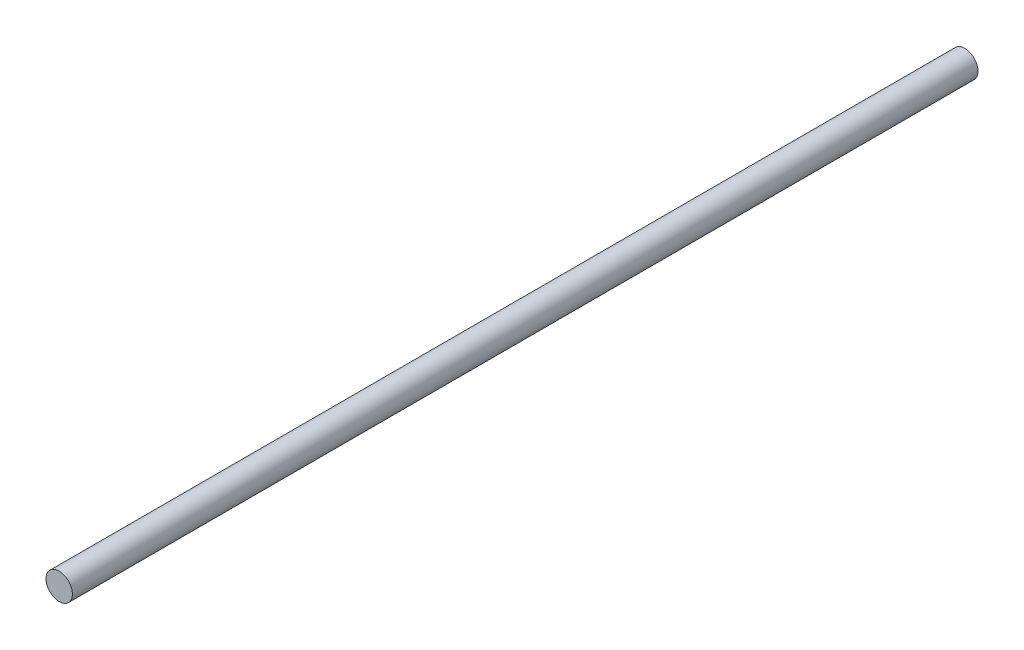
ISO-10303-21;
HEADER;
FILE_DESCRIPTION(('STEP AP214'),'2;1');
FILE_NAME('part.step','',(''),(''),'','','');
FILE_SCHEMA(('AUTOMOTIVE_DESIGN { 1 0 10303 214 1 1 1 1 }'));
ENDSEC;
DATA;
#1=APPLICATION_CONTEXT('core data for automotive mechanical design processes');
#2=APPLICATION_PROTOCOL_DEFINITION('international standard','automotive_design',2000,#1);
#3=PRODUCT_CONTEXT('',#1,'mechanical');
#4=PRODUCT('Part','Part','',(#3));
#5=PRODUCT_RELATED_PRODUCT_CATEGORY('part','',(#4));
#6=PRODUCT_DEFINITION_FORMATION('','',#4);
#7=PRODUCT_DEFINITION_CONTEXT('part definition',#1,'design');
#8=PRODUCT_DEFINITION('design','',#6,#7);
#9=PRODUCT_DEFINITION_SHAPE('','',#8);
#10=(LENGTH_UNIT() NAMED_UNIT(*) SI_UNIT(.MILLI.,.METRE.));
#11=(NAMED_UNIT(*) PLANE_ANGLE_UNIT() SI_UNIT($,.RADIAN.));
#12=(NAMED_UNIT(*) SI_UNIT($,.STERADIAN.) SOLID_ANGLE_UNIT());
#13=UNCERTAINTY_MEASURE_WITH_UNIT(LENGTH_MEASURE(1.E-05),#10,'distance_accuracy_value','');
#14=(GEOMETRIC_REPRESENTATION_CONTEXT(3) GLOBAL_UNCERTAINTY_ASSIGNED_CONTEXT((#13)) GLOBAL_UNIT_ASSIGNED_CONTEXT((#10,
#11,#12)) REPRESENTATION_CONTEXT('',''));
#15=CARTESIAN_POINT('',(0.,0.,0.));
#16=DIRECTION('',(0.,0.,1.));
#17=DIRECTION('',(1.,0.,0.));
#18=AXIS2_PLACEMENT_3D('',#15,#16,#17);
#19=CARTESIAN_POINT('',(0.,0.,240.));
#20=DIRECTION('',(0.,0.,-1.));
#21=DIRECTION('',(-1.,0.,0.));
#22=AXIS2_PLACEMENT_3D('',#19,#20,#21);
#23=CYLINDRICAL_SURFACE('',#22,3.5);
#24=CARTESIAN_POINT('',(0.,0.,240.));
#25=DIRECTION('',(0.,0.,1.));
#26=DIRECTION('',(1.,0.,0.));
#27=AXIS2_PLACEMENT_3D('',#24,#25,#26);
#28=CIRCLE('',#27,3.5);
#29=CARTESIAN_POINT('',(3.5,0.,240.));
#30=VERTEX_POINT('',#29);
#31=EDGE_CURVE('E10',#30,#30,#28,.T.);
#32=ORIENTED_EDGE('',*,*,#31,.F.);
#33=EDGE_LOOP('',(#32));
#34=FACE_BOUND('',#33,.T.);
#35=CARTESIAN_POINT('',(0.,0.,0.));
#36=DIRECTION('',(0.,0.,1.));
#37=DIRECTION('',(1.,0.,0.));
#38=AXIS2_PLACEMENT_3D('',#35,#36,#37);
#39=CIRCLE('',#38,3.5);
#40=CARTESIAN_POINT('',(3.5,0.,0.));
#41=VERTEX_POINT('',#40);
#42=EDGE_CURVE('E36',#41,#41,#39,.T.);
#43=ORIENTED_EDGE('',*,*,#42,.T.);
#44=EDGE_LOOP('',(#43));
#45=FACE_BOUND('',#44,.T.);
#46=ADVANCED_FACE('F33',(#34,#45),#23,.T.);
#47=CARTESIAN_POINT('',(0.,0.,240.));
#48=DIRECTION('',(0.,0.,1.));
#49=DIRECTION('',(1.,0.,0.));
#50=AXIS2_PLACEMENT_3D('',#47,#48,#49);
#51=PLANE('',#50);
#52=ORIENTED_EDGE('',*,*,#31,.T.);
#53=EDGE_LOOP('',(#52));
#54=FACE_BOUND('',#53,.T.);
#55=ADVANCED_FACE('F48',(#54),#51,.T.);
#56=CARTESIAN_POINT('',(0.,0.,0.));
#57=DIRECTION('',(0.,0.,1.));
#58=DIRECTION('',(1.,0.,0.));
#59=AXIS2_PLACEMENT_3D('',#56,#57,#58);
#60=PLANE('',#59);
#61=ORIENTED_EDGE('',*,*,#42,.F.);
#62=EDGE_LOOP('',(#61));
#63=FACE_BOUND('',#62,.T.);
#64=ADVANCED_FACE('F46',(#63),#60,.F.);
#65=CLOSED_SHELL('',(#46,#55,#64));
#66=MANIFOLD_SOLID_BREP('B2',#65);
#67=ADVANCED_BREP_SHAPE_REPRESENTATION('',(#18,#66),#14);
#68=SHAPE_DEFINITION_REPRESENTATION(#9,#67);
ENDSEC;
END-ISO-10303-21;
